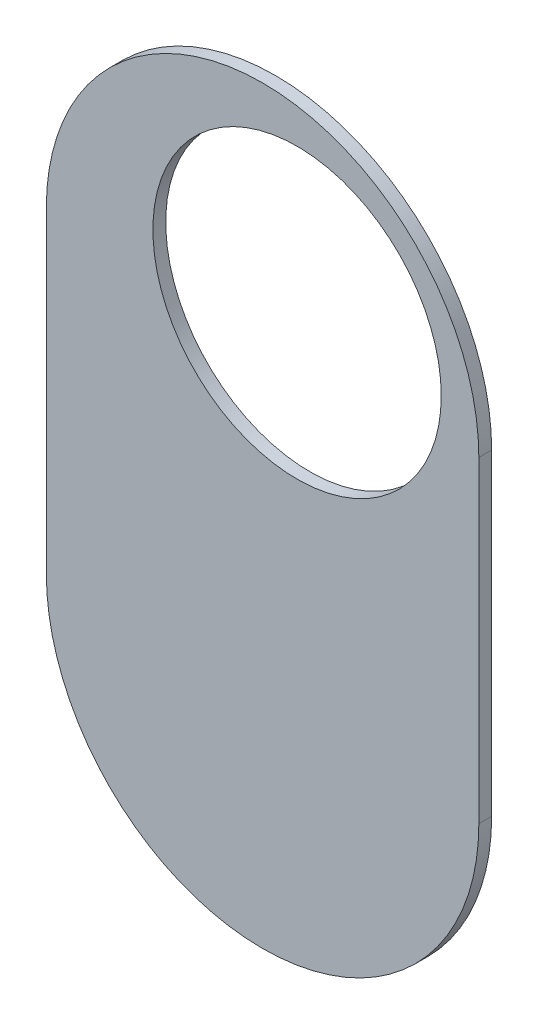
ISO-10303-21;
HEADER;
FILE_DESCRIPTION(('STEP AP214'),'2;1');
FILE_NAME('part.step','',(''),(''),'','','');
FILE_SCHEMA(('AUTOMOTIVE_DESIGN { 1 0 10303 214 1 1 1 1 }'));
ENDSEC;
DATA;
#1=APPLICATION_CONTEXT('core data for automotive mechanical design processes');
#2=APPLICATION_PROTOCOL_DEFINITION('international standard','automotive_design',2000,#1);
#3=PRODUCT_CONTEXT('',#1,'mechanical');
#4=PRODUCT('Part','Part','',(#3));
#5=PRODUCT_RELATED_PRODUCT_CATEGORY('part','',(#4));
#6=PRODUCT_DEFINITION_FORMATION('','',#4);
#7=PRODUCT_DEFINITION_CONTEXT('part definition',#1,'design');
#8=PRODUCT_DEFINITION('design','',#6,#7);
#9=PRODUCT_DEFINITION_SHAPE('','',#8);
#10=(LENGTH_UNIT() NAMED_UNIT(*) SI_UNIT(.MILLI.,.METRE.));
#11=(NAMED_UNIT(*) PLANE_ANGLE_UNIT() SI_UNIT($,.RADIAN.));
#12=(NAMED_UNIT(*) SI_UNIT($,.STERADIAN.) SOLID_ANGLE_UNIT());
#13=UNCERTAINTY_MEASURE_WITH_UNIT(LENGTH_MEASURE(1.E-05),#10,'distance_accuracy_value','');
#14=(GEOMETRIC_REPRESENTATION_CONTEXT(3) GLOBAL_UNCERTAINTY_ASSIGNED_CONTEXT((#13)) GLOBAL_UNIT_ASSIGNED_CONTEXT((#10,
#11,#12)) REPRESENTATION_CONTEXT('',''));
#15=CARTESIAN_POINT('',(0.,0.,0.));
#16=DIRECTION('',(0.,0.,1.));
#17=DIRECTION('',(1.,0.,0.));
#18=AXIS2_PLACEMENT_3D('',#15,#16,#17);
#19=CARTESIAN_POINT('',(86.2143437,98.2143705,0.));
#20=DIRECTION('',(-1.,0.,0.));
#21=DIRECTION('',(0.,1.,0.));
#22=AXIS2_PLACEMENT_3D('',#19,#20,#21);
#23=PLANE('',#22);
#24=DIRECTION('',(0.,1.,0.));
#25=VECTOR('',#24,1.);
#26=CARTESIAN_POINT('',(86.2143437,98.2143705,0.03556));
#27=LINE('',#26,#25);
#28=CARTESIAN_POINT('',(86.2143437,98.2143705,0.03556));
#29=VERTEX_POINT('',#28);
#30=CARTESIAN_POINT('',(86.2143437,99.0943281,0.03556));
#31=VERTEX_POINT('',#30);
#32=EDGE_CURVE('E11',#29,#31,#27,.T.);
#33=ORIENTED_EDGE('',*,*,#32,.F.);
#34=DIRECTION('',(0.,0.,1.));
#35=VECTOR('',#34,1.);
#36=CARTESIAN_POINT('',(86.2143437,98.2143705,0.));
#37=LINE('',#36,#35);
#38=CARTESIAN_POINT('',(86.2143437,98.2143705,0.));
#39=VERTEX_POINT('',#38);
#40=EDGE_CURVE('E24',#39,#29,#37,.T.);
#41=ORIENTED_EDGE('',*,*,#40,.F.);
#42=DIRECTION('',(0.,1.,0.));
#43=VECTOR('',#42,1.);
#44=CARTESIAN_POINT('',(86.2143437,98.2143705,0.));
#45=LINE('',#44,#43);
#46=CARTESIAN_POINT('',(86.2143437,99.0943281,0.));
#47=VERTEX_POINT('',#46);
#48=EDGE_CURVE('E96',#39,#47,#45,.T.);
#49=ORIENTED_EDGE('',*,*,#48,.T.);
#50=DIRECTION('',(0.,0.,1.));
#51=VECTOR('',#50,1.);
#52=CARTESIAN_POINT('',(86.2143437,99.0943281,0.));
#53=LINE('',#52,#51);
#54=EDGE_CURVE('E37',#47,#31,#53,.T.);
#55=ORIENTED_EDGE('',*,*,#54,.T.);
#56=EDGE_LOOP('',(#33,#41,#49,#55));
#57=FACE_BOUND('',#56,.T.);
#58=ADVANCED_FACE('F17',(#57),#23,.F.);
#59=CARTESIAN_POINT('',(85.6143449,98.2143705,0.));
#60=DIRECTION('',(0.,0.,-1.));
#61=DIRECTION('',(-1.,0.,0.));
#62=AXIS2_PLACEMENT_3D('',#59,#60,#61);
#63=CYLINDRICAL_SURFACE('',#62,0.599998799999995);
#64=CARTESIAN_POINT('',(85.6143449,98.2143705,0.03556));
#65=DIRECTION('',(0.,0.,1.));
#66=DIRECTION('',(-1.,0.,0.));
#67=AXIS2_PLACEMENT_3D('',#64,#65,#66);
#68=CIRCLE('',#67,0.599998799999995);
#69=CARTESIAN_POINT('',(85.0143461,98.2143705,0.03556));
#70=VERTEX_POINT('',#69);
#71=EDGE_CURVE('E92',#70,#29,#68,.T.);
#72=ORIENTED_EDGE('',*,*,#71,.F.);
#73=DIRECTION('',(0.,0.,1.));
#74=VECTOR('',#73,1.);
#75=CARTESIAN_POINT('',(85.0143461,98.2143705,0.));
#76=LINE('',#75,#74);
#77=CARTESIAN_POINT('',(85.0143461,98.2143705,0.));
#78=VERTEX_POINT('',#77);
#79=EDGE_CURVE('E90',#78,#70,#76,.T.);
#80=ORIENTED_EDGE('',*,*,#79,.F.);
#81=CARTESIAN_POINT('',(85.6143449,98.2143705,0.));
#82=DIRECTION('',(0.,0.,1.));
#83=DIRECTION('',(-1.,0.,0.));
#84=AXIS2_PLACEMENT_3D('',#81,#82,#83);
#85=CIRCLE('',#84,0.599998799999995);
#86=EDGE_CURVE('E88',#78,#39,#85,.T.);
#87=ORIENTED_EDGE('',*,*,#86,.T.);
#88=ORIENTED_EDGE('',*,*,#40,.T.);
#89=EDGE_LOOP('',(#72,#80,#87,#88));
#90=FACE_BOUND('',#89,.T.);
#91=ADVANCED_FACE('F111',(#90),#63,.T.);
#92=CARTESIAN_POINT('',(85.6143449,99.0943281,0.));
#93=DIRECTION('',(0.,0.,-1.));
#94=DIRECTION('',(1.,0.,0.));
#95=AXIS2_PLACEMENT_3D('',#92,#93,#94);
#96=CYLINDRICAL_SURFACE('',#95,0.599998799999995);
#97=CARTESIAN_POINT('',(85.6143449,99.0943281,0.03556));
#98=DIRECTION('',(0.,0.,1.));
#99=DIRECTION('',(1.,0.,0.));
#100=AXIS2_PLACEMENT_3D('',#97,#98,#99);
#101=CIRCLE('',#100,0.599998799999995);
#102=CARTESIAN_POINT('',(85.0143461,99.0943281,0.03556));
#103=VERTEX_POINT('',#102);
#104=EDGE_CURVE('E85',#31,#103,#101,.T.);
#105=ORIENTED_EDGE('',*,*,#104,.F.);
#106=ORIENTED_EDGE('',*,*,#54,.F.);
#107=CARTESIAN_POINT('',(85.6143449,99.0943281,0.));
#108=DIRECTION('',(0.,0.,1.));
#109=DIRECTION('',(1.,0.,0.));
#110=AXIS2_PLACEMENT_3D('',#107,#108,#109);
#111=CIRCLE('',#110,0.599998799999995);
#112=CARTESIAN_POINT('',(85.0143461,99.0943281,0.));
#113=VERTEX_POINT('',#112);
#114=EDGE_CURVE('E82',#47,#113,#111,.T.);
#115=ORIENTED_EDGE('',*,*,#114,.T.);
#116=DIRECTION('',(0.,0.,1.));
#117=VECTOR('',#116,1.);
#118=CARTESIAN_POINT('',(85.0143461,99.0943281,0.));
#119=LINE('',#118,#117);
#120=EDGE_CURVE('E80',#113,#103,#119,.T.);
#121=ORIENTED_EDGE('',*,*,#120,.T.);
#122=EDGE_LOOP('',(#105,#106,#115,#121));
#123=FACE_BOUND('',#122,.T.);
#124=ADVANCED_FACE('F104',(#123),#96,.T.);
#125=CARTESIAN_POINT('',(85.0143461,99.0943281,0.));
#126=DIRECTION('',(1.,0.,0.));
#127=DIRECTION('',(0.,-1.,0.));
#128=AXIS2_PLACEMENT_3D('',#125,#126,#127);
#129=PLANE('',#128);
#130=DIRECTION('',(0.,-1.,0.));
#131=VECTOR('',#130,1.);
#132=CARTESIAN_POINT('',(85.0143461,99.0943281,0.03556));
#133=LINE('',#132,#131);
#134=EDGE_CURVE('E77',#103,#70,#133,.T.);
#135=ORIENTED_EDGE('',*,*,#134,.F.);
#136=ORIENTED_EDGE('',*,*,#120,.F.);
#137=DIRECTION('',(0.,-1.,0.));
#138=VECTOR('',#137,1.);
#139=CARTESIAN_POINT('',(85.0143461,99.0943281,0.));
#140=LINE('',#139,#138);
#141=EDGE_CURVE('E68',#113,#78,#140,.T.);
#142=ORIENTED_EDGE('',*,*,#141,.T.);
#143=ORIENTED_EDGE('',*,*,#79,.T.);
#144=EDGE_LOOP('',(#135,#136,#142,#143));
#145=FACE_BOUND('',#144,.T.);
#146=ADVANCED_FACE('F110',(#145),#129,.F.);
#147=CARTESIAN_POINT('',(85.710014,99.1899972,0.));
#148=DIRECTION('',(0.,0.,-1.));
#149=DIRECTION('',(1.,0.,0.));
#150=AXIS2_PLACEMENT_3D('',#147,#148,#149);
#151=CYLINDRICAL_SURFACE('',#150,0.3999992);
#152=DIRECTION('',(0.,0.,1.));
#153=VECTOR('',#152,1.);
#154=CARTESIAN_POINT('',(86.1100132,99.1899972,0.));
#155=LINE('',#154,#153);
#156=CARTESIAN_POINT('',(86.1100132,99.1899972,0.));
#157=VERTEX_POINT('',#156);
#158=CARTESIAN_POINT('',(86.1100132,99.1899972,0.03556));
#159=VERTEX_POINT('',#158);
#160=EDGE_CURVE('E62',#157,#159,#155,.T.);
#161=ORIENTED_EDGE('',*,*,#160,.T.);
#162=CARTESIAN_POINT('',(85.710014,99.1899972,0.03556));
#163=DIRECTION('',(0.,0.,1.));
#164=DIRECTION('',(1.,0.,0.));
#165=AXIS2_PLACEMENT_3D('',#162,#163,#164);
#166=CIRCLE('',#165,0.3999992);
#167=EDGE_CURVE('E67',#159,#159,#166,.T.);
#168=ORIENTED_EDGE('',*,*,#167,.T.);
#169=ORIENTED_EDGE('',*,*,#160,.F.);
#170=CARTESIAN_POINT('',(85.710014,99.1899972,0.));
#171=DIRECTION('',(0.,0.,1.));
#172=DIRECTION('',(1.,0.,0.));
#173=AXIS2_PLACEMENT_3D('',#170,#171,#172);
#174=CIRCLE('',#173,0.3999992);
#175=EDGE_CURVE('E65',#157,#157,#174,.T.);
#176=ORIENTED_EDGE('',*,*,#175,.F.);
#177=EDGE_LOOP('',(#161,#168,#169,#176));
#178=FACE_BOUND('',#177,.T.);
#179=ADVANCED_FACE('F64',(#178),#151,.F.);
#180=CARTESIAN_POINT('',(86.2143437,98.2143705,0.));
#181=DIRECTION('',(0.,0.,-1.));
#182=DIRECTION('',(-1.,0.,0.));
#183=AXIS2_PLACEMENT_3D('',#180,#181,#182);
#184=PLANE('',#183);
#185=ORIENTED_EDGE('',*,*,#48,.F.);
#186=ORIENTED_EDGE('',*,*,#86,.F.);
#187=ORIENTED_EDGE('',*,*,#141,.F.);
#188=ORIENTED_EDGE('',*,*,#114,.F.);
#189=EDGE_LOOP('',(#185,#186,#187,#188));
#190=FACE_BOUND('',#189,.T.);
#191=ORIENTED_EDGE('',*,*,#175,.T.);
#192=EDGE_LOOP('',(#191));
#193=FACE_BOUND('',#192,.T.);
#194=ADVANCED_FACE('F71',(#190,#193),#184,.T.);
#195=CARTESIAN_POINT('',(86.2143437,98.2143705,0.03556));
#196=DIRECTION('',(0.,0.,-1.));
#197=DIRECTION('',(-1.,0.,0.));
#198=AXIS2_PLACEMENT_3D('',#195,#196,#197);
#199=PLANE('',#198);
#200=ORIENTED_EDGE('',*,*,#134,.T.);
#201=ORIENTED_EDGE('',*,*,#71,.T.);
#202=ORIENTED_EDGE('',*,*,#32,.T.);
#203=ORIENTED_EDGE('',*,*,#104,.T.);
#204=EDGE_LOOP('',(#200,#201,#202,#203));
#205=FACE_BOUND('',#204,.T.);
#206=ORIENTED_EDGE('',*,*,#167,.F.);
#207=EDGE_LOOP('',(#206));
#208=FACE_BOUND('',#207,.T.);
#209=ADVANCED_FACE('F107',(#205,#208),#199,.F.);
#210=CLOSED_SHELL('',(#58,#91,#124,#146,#179,#194,#209));
#211=MANIFOLD_SOLID_BREP('B1',#210);
#212=ADVANCED_BREP_SHAPE_REPRESENTATION('',(#18,#211),#14);
#213=SHAPE_DEFINITION_REPRESENTATION(#9,#212);
ENDSEC;
END-ISO-10303-21;
